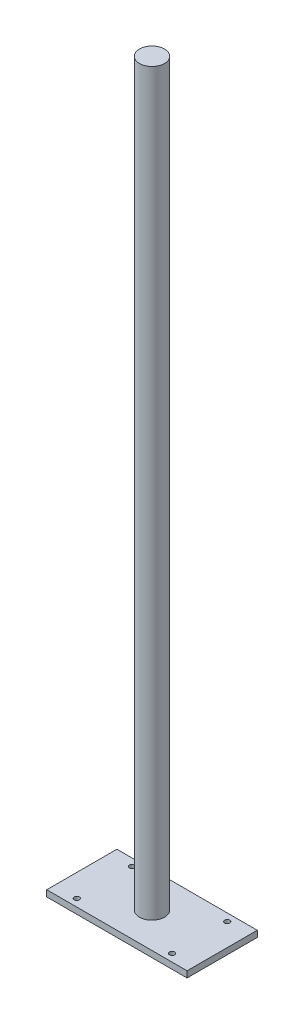
ISO-10303-21;
HEADER;
FILE_DESCRIPTION(('STEP AP214'),'2;1');
FILE_NAME('part.step','',(''),(''),'','','');
FILE_SCHEMA(('AUTOMOTIVE_DESIGN { 1 0 10303 214 1 1 1 1 }'));
ENDSEC;
DATA;
#1=APPLICATION_CONTEXT('core data for automotive mechanical design processes');
#2=APPLICATION_PROTOCOL_DEFINITION('international standard','automotive_design',2000,#1);
#3=PRODUCT_CONTEXT('',#1,'mechanical');
#4=PRODUCT('Part','Part','',(#3));
#5=PRODUCT_RELATED_PRODUCT_CATEGORY('part','',(#4));
#6=PRODUCT_DEFINITION_FORMATION('','',#4);
#7=PRODUCT_DEFINITION_CONTEXT('part definition',#1,'design');
#8=PRODUCT_DEFINITION('design','',#6,#7);
#9=PRODUCT_DEFINITION_SHAPE('','',#8);
#10=(LENGTH_UNIT() NAMED_UNIT(*) SI_UNIT(.MILLI.,.METRE.));
#11=(NAMED_UNIT(*) PLANE_ANGLE_UNIT() SI_UNIT($,.RADIAN.));
#12=(NAMED_UNIT(*) SI_UNIT($,.STERADIAN.) SOLID_ANGLE_UNIT());
#13=UNCERTAINTY_MEASURE_WITH_UNIT(LENGTH_MEASURE(1.E-05),#10,'distance_accuracy_value','');
#14=(GEOMETRIC_REPRESENTATION_CONTEXT(3) GLOBAL_UNCERTAINTY_ASSIGNED_CONTEXT((#13)) GLOBAL_UNIT_ASSIGNED_CONTEXT((#10,
#11,#12)) REPRESENTATION_CONTEXT('',''));
#15=CARTESIAN_POINT('',(0.,0.,0.));
#16=DIRECTION('',(0.,0.,1.));
#17=DIRECTION('',(1.,0.,0.));
#18=AXIS2_PLACEMENT_3D('',#15,#16,#17);
#19=CARTESIAN_POINT('',(-28.,33.5,14.));
#20=DIRECTION('',(1.,0.,0.));
#21=DIRECTION('',(0.,0.,-1.));
#22=AXIS2_PLACEMENT_3D('',#19,#20,#21);
#23=PLANE('',#22);
#24=DIRECTION('',(0.,0.,-1.));
#25=VECTOR('',#24,1.);
#26=CARTESIAN_POINT('',(-28.,36.,14.));
#27=LINE('',#26,#25);
#28=CARTESIAN_POINT('',(-28.,36.,14.));
#29=VERTEX_POINT('',#28);
#30=CARTESIAN_POINT('',(-28.,36.,-14.));
#31=VERTEX_POINT('',#30);
#32=EDGE_CURVE('E104',#29,#31,#27,.T.);
#33=ORIENTED_EDGE('',*,*,#32,.T.);
#34=DIRECTION('',(0.,1.,0.));
#35=VECTOR('',#34,1.);
#36=CARTESIAN_POINT('',(-28.,33.5,-14.));
#37=LINE('',#36,#35);
#38=CARTESIAN_POINT('',(-28.,33.5,-14.));
#39=VERTEX_POINT('',#38);
#40=EDGE_CURVE('E41',#39,#31,#37,.T.);
#41=ORIENTED_EDGE('',*,*,#40,.F.);
#42=DIRECTION('',(0.,0.,-1.));
#43=VECTOR('',#42,1.);
#44=CARTESIAN_POINT('',(-28.,33.5,14.));
#45=LINE('',#44,#43);
#46=CARTESIAN_POINT('',(-28.,33.5,14.));
#47=VERTEX_POINT('',#46);
#48=EDGE_CURVE('E91',#47,#39,#45,.T.);
#49=ORIENTED_EDGE('',*,*,#48,.F.);
#50=DIRECTION('',(0.,1.,0.));
#51=VECTOR('',#50,1.);
#52=CARTESIAN_POINT('',(-28.,33.5,14.));
#53=LINE('',#52,#51);
#54=EDGE_CURVE('E100',#47,#29,#53,.T.);
#55=ORIENTED_EDGE('',*,*,#54,.T.);
#56=EDGE_LOOP('',(#33,#41,#49,#55));
#57=FACE_BOUND('',#56,.T.);
#58=ADVANCED_FACE('F38',(#57),#23,.F.);
#59=CARTESIAN_POINT('',(-28.,33.5,-14.));
#60=DIRECTION('',(0.,0.,1.));
#61=DIRECTION('',(1.,0.,0.));
#62=AXIS2_PLACEMENT_3D('',#59,#60,#61);
#63=PLANE('',#62);
#64=DIRECTION('',(1.,0.,0.));
#65=VECTOR('',#64,1.);
#66=CARTESIAN_POINT('',(-28.,36.,-14.));
#67=LINE('',#66,#65);
#68=CARTESIAN_POINT('',(28.,36.,-14.));
#69=VERTEX_POINT('',#68);
#70=EDGE_CURVE('E96',#31,#69,#67,.T.);
#71=ORIENTED_EDGE('',*,*,#70,.T.);
#72=DIRECTION('',(0.,1.,0.));
#73=VECTOR('',#72,1.);
#74=CARTESIAN_POINT('',(28.,33.5,-14.));
#75=LINE('',#74,#73);
#76=CARTESIAN_POINT('',(28.,33.5,-14.));
#77=VERTEX_POINT('',#76);
#78=EDGE_CURVE('E94',#77,#69,#75,.T.);
#79=ORIENTED_EDGE('',*,*,#78,.F.);
#80=DIRECTION('',(1.,0.,0.));
#81=VECTOR('',#80,1.);
#82=CARTESIAN_POINT('',(-28.,33.5,-14.));
#83=LINE('',#82,#81);
#84=EDGE_CURVE('E86',#39,#77,#83,.T.);
#85=ORIENTED_EDGE('',*,*,#84,.F.);
#86=ORIENTED_EDGE('',*,*,#40,.T.);
#87=EDGE_LOOP('',(#71,#79,#85,#86));
#88=FACE_BOUND('',#87,.T.);
#89=ADVANCED_FACE('F95',(#88),#63,.F.);
#90=CARTESIAN_POINT('',(28.,33.5,14.));
#91=DIRECTION('',(-1.,0.,0.));
#92=DIRECTION('',(0.,0.,1.));
#93=AXIS2_PLACEMENT_3D('',#90,#91,#92);
#94=PLANE('',#93);
#95=DIRECTION('',(0.,0.,1.));
#96=VECTOR('',#95,1.);
#97=CARTESIAN_POINT('',(28.,36.,14.));
#98=LINE('',#97,#96);
#99=CARTESIAN_POINT('',(28.,36.,14.));
#100=VERTEX_POINT('',#99);
#101=EDGE_CURVE('E72',#69,#100,#98,.T.);
#102=ORIENTED_EDGE('',*,*,#101,.T.);
#103=DIRECTION('',(0.,1.,0.));
#104=VECTOR('',#103,1.);
#105=CARTESIAN_POINT('',(28.,33.5,14.));
#106=LINE('',#105,#104);
#107=CARTESIAN_POINT('',(28.,33.5,14.));
#108=VERTEX_POINT('',#107);
#109=EDGE_CURVE('E97',#108,#100,#106,.T.);
#110=ORIENTED_EDGE('',*,*,#109,.F.);
#111=DIRECTION('',(0.,0.,1.));
#112=VECTOR('',#111,1.);
#113=CARTESIAN_POINT('',(28.,33.5,14.));
#114=LINE('',#113,#112);
#115=EDGE_CURVE('E89',#77,#108,#114,.T.);
#116=ORIENTED_EDGE('',*,*,#115,.F.);
#117=ORIENTED_EDGE('',*,*,#78,.T.);
#118=EDGE_LOOP('',(#102,#110,#116,#117));
#119=FACE_BOUND('',#118,.T.);
#120=ADVANCED_FACE('F98',(#119),#94,.F.);
#121=CARTESIAN_POINT('',(-28.,33.5,14.));
#122=DIRECTION('',(0.,0.,-1.));
#123=DIRECTION('',(-1.,0.,0.));
#124=AXIS2_PLACEMENT_3D('',#121,#122,#123);
#125=PLANE('',#124);
#126=DIRECTION('',(-1.,0.,0.));
#127=VECTOR('',#126,1.);
#128=CARTESIAN_POINT('',(-28.,36.,14.));
#129=LINE('',#128,#127);
#130=EDGE_CURVE('E78',#100,#29,#129,.T.);
#131=ORIENTED_EDGE('',*,*,#130,.T.);
#132=ORIENTED_EDGE('',*,*,#54,.F.);
#133=DIRECTION('',(-1.,0.,0.));
#134=VECTOR('',#133,1.);
#135=CARTESIAN_POINT('',(-28.,33.5,14.));
#136=LINE('',#135,#134);
#137=EDGE_CURVE('E55',#108,#47,#136,.T.);
#138=ORIENTED_EDGE('',*,*,#137,.F.);
#139=ORIENTED_EDGE('',*,*,#109,.T.);
#140=EDGE_LOOP('',(#131,#132,#138,#139));
#141=FACE_BOUND('',#140,.T.);
#142=ADVANCED_FACE('F112',(#141),#125,.F.);
#143=CARTESIAN_POINT('',(0.,33.5,0.));
#144=DIRECTION('',(0.,-1.,0.));
#145=DIRECTION('',(0.,0.,-1.));
#146=AXIS2_PLACEMENT_3D('',#143,#144,#145);
#147=PLANE('',#146);
#148=CARTESIAN_POINT('',(19.,33.5,-11.));
#149=DIRECTION('',(0.,-1.,0.));
#150=DIRECTION('',(0.,0.,-1.));
#151=AXIS2_PLACEMENT_3D('',#148,#149,#150);
#152=CIRCLE('',#151,1.02499999999999);
#153=CARTESIAN_POINT('',(19.,33.5,-12.025));
#154=VERTEX_POINT('',#153);
#155=EDGE_CURVE('E141',#154,#154,#152,.T.);
#156=ORIENTED_EDGE('',*,*,#155,.F.);
#157=EDGE_LOOP('',(#156));
#158=FACE_BOUND('',#157,.T.);
#159=CARTESIAN_POINT('',(19.,33.5,11.));
#160=DIRECTION('',(0.,-1.,0.));
#161=DIRECTION('',(0.,0.,-1.));
#162=AXIS2_PLACEMENT_3D('',#159,#160,#161);
#163=CIRCLE('',#162,1.02499999999999);
#164=CARTESIAN_POINT('',(19.,33.5,9.97500000000001));
#165=VERTEX_POINT('',#164);
#166=EDGE_CURVE('E135',#165,#165,#163,.T.);
#167=ORIENTED_EDGE('',*,*,#166,.F.);
#168=EDGE_LOOP('',(#167));
#169=FACE_BOUND('',#168,.T.);
#170=CARTESIAN_POINT('',(-19.,33.5,-11.));
#171=DIRECTION('',(0.,-1.,0.));
#172=DIRECTION('',(0.,0.,-1.));
#173=AXIS2_PLACEMENT_3D('',#170,#171,#172);
#174=CIRCLE('',#173,1.02499999999999);
#175=CARTESIAN_POINT('',(-19.,33.5,-12.025));
#176=VERTEX_POINT('',#175);
#177=EDGE_CURVE('E129',#176,#176,#174,.T.);
#178=ORIENTED_EDGE('',*,*,#177,.F.);
#179=EDGE_LOOP('',(#178));
#180=FACE_BOUND('',#179,.T.);
#181=CARTESIAN_POINT('',(-19.,33.5,11.));
#182=DIRECTION('',(0.,-1.,0.));
#183=DIRECTION('',(0.,0.,-1.));
#184=AXIS2_PLACEMENT_3D('',#181,#182,#183);
#185=CIRCLE('',#184,1.02499999999999);
#186=CARTESIAN_POINT('',(-19.,33.5,9.97500000000001));
#187=VERTEX_POINT('',#186);
#188=EDGE_CURVE('E123',#187,#187,#185,.T.);
#189=ORIENTED_EDGE('',*,*,#188,.F.);
#190=EDGE_LOOP('',(#189));
#191=FACE_BOUND('',#190,.T.);
#192=ORIENTED_EDGE('',*,*,#48,.T.);
#193=ORIENTED_EDGE('',*,*,#84,.T.);
#194=ORIENTED_EDGE('',*,*,#115,.T.);
#195=ORIENTED_EDGE('',*,*,#137,.T.);
#196=EDGE_LOOP('',(#192,#193,#194,#195));
#197=FACE_BOUND('',#196,.T.);
#198=ADVANCED_FACE('F87',(#158,#169,#180,#191,#197),#147,.T.);
#199=CARTESIAN_POINT('',(0.,36.,0.));
#200=DIRECTION('',(0.,-1.,0.));
#201=DIRECTION('',(0.,0.,-1.));
#202=AXIS2_PLACEMENT_3D('',#199,#200,#201);
#203=PLANE('',#202);
#204=CARTESIAN_POINT('',(19.,36.,-11.));
#205=DIRECTION('',(0.,-1.,0.));
#206=DIRECTION('',(0.,0.,-1.));
#207=AXIS2_PLACEMENT_3D('',#204,#205,#206);
#208=CIRCLE('',#207,1.02499999999999);
#209=CARTESIAN_POINT('',(19.,36.,-12.025));
#210=VERTEX_POINT('',#209);
#211=EDGE_CURVE('E138',#210,#210,#208,.T.);
#212=ORIENTED_EDGE('',*,*,#211,.T.);
#213=EDGE_LOOP('',(#212));
#214=FACE_BOUND('',#213,.T.);
#215=CARTESIAN_POINT('',(19.,36.,11.));
#216=DIRECTION('',(0.,-1.,0.));
#217=DIRECTION('',(0.,0.,-1.));
#218=AXIS2_PLACEMENT_3D('',#215,#216,#217);
#219=CIRCLE('',#218,1.02499999999999);
#220=CARTESIAN_POINT('',(19.,36.,9.975));
#221=VERTEX_POINT('',#220);
#222=EDGE_CURVE('E132',#221,#221,#219,.T.);
#223=ORIENTED_EDGE('',*,*,#222,.T.);
#224=EDGE_LOOP('',(#223));
#225=FACE_BOUND('',#224,.T.);
#226=CARTESIAN_POINT('',(-19.,36.,-11.));
#227=DIRECTION('',(0.,-1.,0.));
#228=DIRECTION('',(0.,0.,-1.));
#229=AXIS2_PLACEMENT_3D('',#226,#227,#228);
#230=CIRCLE('',#229,1.02499999999999);
#231=CARTESIAN_POINT('',(-19.,36.,-12.025));
#232=VERTEX_POINT('',#231);
#233=EDGE_CURVE('E126',#232,#232,#230,.T.);
#234=ORIENTED_EDGE('',*,*,#233,.T.);
#235=EDGE_LOOP('',(#234));
#236=FACE_BOUND('',#235,.T.);
#237=CARTESIAN_POINT('',(-19.,36.,11.));
#238=DIRECTION('',(0.,-1.,0.));
#239=DIRECTION('',(0.,0.,-1.));
#240=AXIS2_PLACEMENT_3D('',#237,#238,#239);
#241=CIRCLE('',#240,1.02499999999999);
#242=CARTESIAN_POINT('',(-19.,36.,9.975));
#243=VERTEX_POINT('',#242);
#244=EDGE_CURVE('E120',#243,#243,#241,.T.);
#245=ORIENTED_EDGE('',*,*,#244,.T.);
#246=EDGE_LOOP('',(#245));
#247=FACE_BOUND('',#246,.T.);
#248=CARTESIAN_POINT('',(0.,36.,0.));
#249=DIRECTION('',(0.,1.,0.));
#250=DIRECTION('',(0.,0.,1.));
#251=AXIS2_PLACEMENT_3D('',#248,#249,#250);
#252=CIRCLE('',#251,5.);
#253=CARTESIAN_POINT('',(0.,36.,5.));
#254=VERTEX_POINT('',#253);
#255=EDGE_CURVE('E11',#254,#254,#252,.T.);
#256=ORIENTED_EDGE('',*,*,#255,.F.);
#257=EDGE_LOOP('',(#256));
#258=FACE_BOUND('',#257,.T.);
#259=ORIENTED_EDGE('',*,*,#32,.F.);
#260=ORIENTED_EDGE('',*,*,#130,.F.);
#261=ORIENTED_EDGE('',*,*,#101,.F.);
#262=ORIENTED_EDGE('',*,*,#70,.F.);
#263=EDGE_LOOP('',(#259,#260,#261,#262));
#264=FACE_BOUND('',#263,.T.);
#265=ADVANCED_FACE('F115',(#214,#225,#236,#247,#258,#264),#203,.F.);
#266=CARTESIAN_POINT('',(0.,331.,0.));
#267=DIRECTION('',(0.,-1.,0.));
#268=DIRECTION('',(0.,0.,-1.));
#269=AXIS2_PLACEMENT_3D('',#266,#267,#268);
#270=CYLINDRICAL_SURFACE('',#269,5.);
#271=CARTESIAN_POINT('',(0.,331.,0.));
#272=DIRECTION('',(0.,1.,0.));
#273=DIRECTION('',(0.,0.,1.));
#274=AXIS2_PLACEMENT_3D('',#271,#272,#273);
#275=CIRCLE('',#274,5.);
#276=CARTESIAN_POINT('',(0.,331.,5.));
#277=VERTEX_POINT('',#276);
#278=EDGE_CURVE('E107',#277,#277,#275,.T.);
#279=ORIENTED_EDGE('',*,*,#278,.F.);
#280=EDGE_LOOP('',(#279));
#281=FACE_BOUND('',#280,.T.);
#282=ORIENTED_EDGE('',*,*,#255,.T.);
#283=EDGE_LOOP('',(#282));
#284=FACE_BOUND('',#283,.T.);
#285=ADVANCED_FACE('F169',(#281,#284),#270,.T.);
#286=CARTESIAN_POINT('',(0.,331.,0.));
#287=DIRECTION('',(0.,1.,0.));
#288=DIRECTION('',(0.,0.,1.));
#289=AXIS2_PLACEMENT_3D('',#286,#287,#288);
#290=PLANE('',#289);
#291=ORIENTED_EDGE('',*,*,#278,.T.);
#292=EDGE_LOOP('',(#291));
#293=FACE_BOUND('',#292,.T.);
#294=ADVANCED_FACE('F159',(#293),#290,.T.);
#295=CARTESIAN_POINT('',(-19.,33.5,11.));
#296=DIRECTION('',(0.,-1.,0.));
#297=DIRECTION('',(0.,0.,-1.));
#298=AXIS2_PLACEMENT_3D('',#295,#296,#297);
#299=CYLINDRICAL_SURFACE('',#298,1.02499999999999);
#300=ORIENTED_EDGE('',*,*,#244,.F.);
#301=EDGE_LOOP('',(#300));
#302=FACE_BOUND('',#301,.T.);
#303=ORIENTED_EDGE('',*,*,#188,.T.);
#304=EDGE_LOOP('',(#303));
#305=FACE_BOUND('',#304,.T.);
#306=ADVANCED_FACE('F156',(#302,#305),#299,.F.);
#307=CARTESIAN_POINT('',(-19.,33.5,-11.));
#308=DIRECTION('',(0.,-1.,0.));
#309=DIRECTION('',(0.,0.,-1.));
#310=AXIS2_PLACEMENT_3D('',#307,#308,#309);
#311=CYLINDRICAL_SURFACE('',#310,1.02499999999999);
#312=ORIENTED_EDGE('',*,*,#233,.F.);
#313=EDGE_LOOP('',(#312));
#314=FACE_BOUND('',#313,.T.);
#315=ORIENTED_EDGE('',*,*,#177,.T.);
#316=EDGE_LOOP('',(#315));
#317=FACE_BOUND('',#316,.T.);
#318=ADVANCED_FACE('F158',(#314,#317),#311,.F.);
#319=CARTESIAN_POINT('',(19.,33.5,11.));
#320=DIRECTION('',(0.,-1.,0.));
#321=DIRECTION('',(0.,0.,-1.));
#322=AXIS2_PLACEMENT_3D('',#319,#320,#321);
#323=CYLINDRICAL_SURFACE('',#322,1.02499999999999);
#324=ORIENTED_EDGE('',*,*,#222,.F.);
#325=EDGE_LOOP('',(#324));
#326=FACE_BOUND('',#325,.T.);
#327=ORIENTED_EDGE('',*,*,#166,.T.);
#328=EDGE_LOOP('',(#327));
#329=FACE_BOUND('',#328,.T.);
#330=ADVANCED_FACE('F166',(#326,#329),#323,.F.);
#331=CARTESIAN_POINT('',(19.,33.5,-11.));
#332=DIRECTION('',(0.,-1.,0.));
#333=DIRECTION('',(0.,0.,-1.));
#334=AXIS2_PLACEMENT_3D('',#331,#332,#333);
#335=CYLINDRICAL_SURFACE('',#334,1.02499999999999);
#336=ORIENTED_EDGE('',*,*,#211,.F.);
#337=EDGE_LOOP('',(#336));
#338=FACE_BOUND('',#337,.T.);
#339=ORIENTED_EDGE('',*,*,#155,.T.);
#340=EDGE_LOOP('',(#339));
#341=FACE_BOUND('',#340,.T.);
#342=ADVANCED_FACE('F145',(#338,#341),#335,.F.);
#343=CLOSED_SHELL('',(#58,#89,#120,#142,#198,#265,#285,#294,#306,#318,#330,#342));
#344=MANIFOLD_SOLID_BREP('B2',#343);
#345=ADVANCED_BREP_SHAPE_REPRESENTATION('',(#18,#344),#14);
#346=SHAPE_DEFINITION_REPRESENTATION(#9,#345);
ENDSEC;
END-ISO-10303-21;
